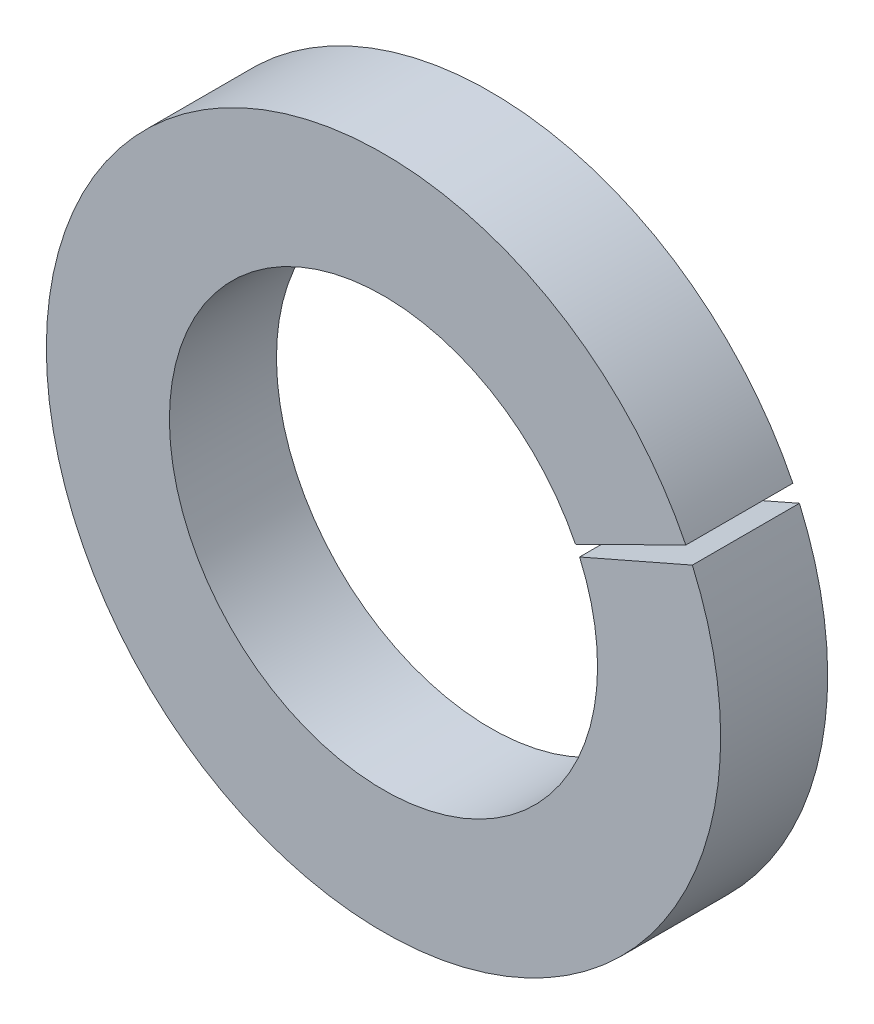
ISO-10303-21;
HEADER;
FILE_DESCRIPTION(('STEP AP214'),'2;1');
FILE_NAME('part.step','',(''),(''),'','','');
FILE_SCHEMA(('AUTOMOTIVE_DESIGN { 1 0 10303 214 1 1 1 1 }'));
ENDSEC;
DATA;
#1=APPLICATION_CONTEXT('core data for automotive mechanical design processes');
#2=APPLICATION_PROTOCOL_DEFINITION('international standard','automotive_design',2000,#1);
#3=PRODUCT_CONTEXT('',#1,'mechanical');
#4=PRODUCT('Part','Part','',(#3));
#5=PRODUCT_RELATED_PRODUCT_CATEGORY('part','',(#4));
#6=PRODUCT_DEFINITION_FORMATION('','',#4);
#7=PRODUCT_DEFINITION_CONTEXT('part definition',#1,'design');
#8=PRODUCT_DEFINITION('design','',#6,#7);
#9=PRODUCT_DEFINITION_SHAPE('','',#8);
#10=(LENGTH_UNIT() NAMED_UNIT(*) SI_UNIT(.MILLI.,.METRE.));
#11=(NAMED_UNIT(*) PLANE_ANGLE_UNIT() SI_UNIT($,.RADIAN.));
#12=(NAMED_UNIT(*) SI_UNIT($,.STERADIAN.) SOLID_ANGLE_UNIT());
#13=UNCERTAINTY_MEASURE_WITH_UNIT(LENGTH_MEASURE(1.E-05),#10,'distance_accuracy_value','');
#14=(GEOMETRIC_REPRESENTATION_CONTEXT(3) GLOBAL_UNCERTAINTY_ASSIGNED_CONTEXT((#13)) GLOBAL_UNIT_ASSIGNED_CONTEXT((#10,
#11,#12)) REPRESENTATION_CONTEXT('',''));
#15=CARTESIAN_POINT('',(0.,0.,0.));
#16=DIRECTION('',(0.,0.,1.));
#17=DIRECTION('',(1.,0.,0.));
#18=AXIS2_PLACEMENT_3D('',#15,#16,#17);
#19=CARTESIAN_POINT('',(0.,0.,1.));
#20=DIRECTION('',(0.,0.,1.));
#21=DIRECTION('',(1.,0.,0.));
#22=AXIS2_PLACEMENT_3D('',#19,#20,#21);
#23=PLANE('',#22);
#24=DIRECTION('',(0.91612800253932,0.400885872741003,0.));
#25=VECTOR('',#24,1.);
#26=CARTESIAN_POINT('',(4.81245926481222,2.10587049741662,1.));
#27=LINE('',#26,#25);
#28=CARTESIAN_POINT('',(1.83225600507864,0.801771745482005,1.));
#29=VERTEX_POINT('',#28);
#30=CARTESIAN_POINT('',(2.88580320799886,1.26279049913416,1.));
#31=VERTEX_POINT('',#30);
#32=EDGE_CURVE('E77',#29,#31,#27,.T.);
#33=ORIENTED_EDGE('',*,*,#32,.F.);
#34=CARTESIAN_POINT('',(0.,0.,1.));
#35=DIRECTION('',(0.,0.,1.));
#36=DIRECTION('',(1.,0.,0.));
#37=AXIS2_PLACEMENT_3D('',#34,#35,#36);
#38=CIRCLE('',#37,2.);
#39=CARTESIAN_POINT('',(1.79340092634827,0.88527572957421,1.));
#40=VERTEX_POINT('',#39);
#41=EDGE_CURVE('E86',#40,#29,#38,.T.);
#42=ORIENTED_EDGE('',*,*,#41,.F.);
#43=DIRECTION('',(-0.896700463174137,-0.442637864787105,0.));
#44=VECTOR('',#43,1.);
#45=CARTESIAN_POINT('',(0.,0.,1.));
#46=LINE('',#45,#44);
#47=CARTESIAN_POINT('',(2.82460645899853,1.39430927407938,1.));
#48=VERTEX_POINT('',#47);
#49=EDGE_CURVE('E60',#48,#40,#46,.T.);
#50=ORIENTED_EDGE('',*,*,#49,.F.);
#51=CARTESIAN_POINT('',(0.,0.,1.));
#52=DIRECTION('',(0.,0.,1.));
#53=DIRECTION('',(1.,0.,0.));
#54=AXIS2_PLACEMENT_3D('',#51,#52,#53);
#55=CIRCLE('',#54,3.15);
#56=EDGE_CURVE('E88',#48,#31,#55,.T.);
#57=ORIENTED_EDGE('',*,*,#56,.T.);
#58=EDGE_LOOP('',(#33,#42,#50,#57));
#59=FACE_BOUND('',#58,.T.);
#60=ADVANCED_FACE('F38',(#59),#23,.T.);
#61=CARTESIAN_POINT('',(0.,0.,0.));
#62=DIRECTION('',(0.,0.,1.));
#63=DIRECTION('',(1.,0.,0.));
#64=AXIS2_PLACEMENT_3D('',#61,#62,#63);
#65=PLANE('',#64);
#66=CARTESIAN_POINT('',(0.,0.,0.));
#67=DIRECTION('',(0.,0.,1.));
#68=DIRECTION('',(1.,0.,0.));
#69=AXIS2_PLACEMENT_3D('',#66,#67,#68);
#70=CIRCLE('',#69,2.);
#71=CARTESIAN_POINT('',(1.79340092634828,0.88527572957421,0.));
#72=VERTEX_POINT('',#71);
#73=CARTESIAN_POINT('',(1.83225600507864,0.801771745482006,0.));
#74=VERTEX_POINT('',#73);
#75=EDGE_CURVE('E92',#72,#74,#70,.T.);
#76=ORIENTED_EDGE('',*,*,#75,.T.);
#77=DIRECTION('',(0.91612800253932,0.400885872741003,0.));
#78=VECTOR('',#77,1.);
#79=CARTESIAN_POINT('',(0.,0.,0.));
#80=LINE('',#79,#78);
#81=CARTESIAN_POINT('',(2.88580320799886,1.26279049913416,0.));
#82=VERTEX_POINT('',#81);
#83=EDGE_CURVE('E52',#74,#82,#80,.T.);
#84=ORIENTED_EDGE('',*,*,#83,.T.);
#85=CARTESIAN_POINT('',(0.,0.,0.));
#86=DIRECTION('',(0.,0.,1.));
#87=DIRECTION('',(1.,0.,0.));
#88=AXIS2_PLACEMENT_3D('',#85,#86,#87);
#89=CIRCLE('',#88,3.15);
#90=CARTESIAN_POINT('',(2.82460645899853,1.39430927407938,0.));
#91=VERTEX_POINT('',#90);
#92=EDGE_CURVE('E91',#91,#82,#89,.T.);
#93=ORIENTED_EDGE('',*,*,#92,.F.);
#94=DIRECTION('',(-0.896700463174138,-0.442637864787105,0.));
#95=VECTOR('',#94,1.);
#96=CARTESIAN_POINT('',(0.,0.,0.));
#97=LINE('',#96,#95);
#98=EDGE_CURVE('E103',#91,#72,#97,.T.);
#99=ORIENTED_EDGE('',*,*,#98,.T.);
#100=EDGE_LOOP('',(#76,#84,#93,#99));
#101=FACE_BOUND('',#100,.T.);
#102=ADVANCED_FACE('F107',(#101),#65,.F.);
#103=CARTESIAN_POINT('',(0.,0.,1.));
#104=DIRECTION('',(0.,0.,-1.));
#105=DIRECTION('',(-1.,0.,0.));
#106=AXIS2_PLACEMENT_3D('',#103,#104,#105);
#107=CYLINDRICAL_SURFACE('',#106,3.15);
#108=ORIENTED_EDGE('',*,*,#92,.T.);
#109=DIRECTION('',(0.,0.,-1.));
#110=VECTOR('',#109,1.);
#111=CARTESIAN_POINT('',(2.88580320799886,1.26279049913416,1.));
#112=LINE('',#111,#110);
#113=EDGE_CURVE('E96',#82,#31,#112,.F.);
#114=ORIENTED_EDGE('',*,*,#113,.T.);
#115=ORIENTED_EDGE('',*,*,#56,.F.);
#116=DIRECTION('',(0.,0.,-1.));
#117=VECTOR('',#116,1.);
#118=CARTESIAN_POINT('',(2.82460645899853,1.39430927407938,1.));
#119=LINE('',#118,#117);
#120=EDGE_CURVE('E108',#48,#91,#119,.T.);
#121=ORIENTED_EDGE('',*,*,#120,.T.);
#122=EDGE_LOOP('',(#108,#114,#115,#121));
#123=FACE_BOUND('',#122,.T.);
#124=ADVANCED_FACE('F40',(#123),#107,.T.);
#125=CARTESIAN_POINT('',(0.,0.,1.));
#126=DIRECTION('',(0.,0.,-1.));
#127=DIRECTION('',(-1.,0.,0.));
#128=AXIS2_PLACEMENT_3D('',#125,#126,#127);
#129=CYLINDRICAL_SURFACE('',#128,2.);
#130=DIRECTION('',(0.,0.,-1.));
#131=VECTOR('',#130,1.);
#132=CARTESIAN_POINT('',(1.83225600507864,0.801771745482006,1.));
#133=LINE('',#132,#131);
#134=EDGE_CURVE('E11',#74,#29,#133,.F.);
#135=ORIENTED_EDGE('',*,*,#134,.F.);
#136=ORIENTED_EDGE('',*,*,#75,.F.);
#137=DIRECTION('',(0.,0.,-1.));
#138=VECTOR('',#137,1.);
#139=CARTESIAN_POINT('',(1.79340092634828,0.88527572957421,1.));
#140=LINE('',#139,#138);
#141=EDGE_CURVE('E46',#40,#72,#140,.T.);
#142=ORIENTED_EDGE('',*,*,#141,.F.);
#143=ORIENTED_EDGE('',*,*,#41,.T.);
#144=EDGE_LOOP('',(#135,#136,#142,#143));
#145=FACE_BOUND('',#144,.T.);
#146=ADVANCED_FACE('F90',(#145),#129,.F.);
#147=CARTESIAN_POINT('',(0.,0.,-9.));
#148=DIRECTION('',(-0.442637864787105,0.896700463174138,0.));
#149=DIRECTION('',(-0.896700463174138,-0.442637864787105,0.));
#150=AXIS2_PLACEMENT_3D('',#147,#148,#149);
#151=PLANE('',#150);
#152=ORIENTED_EDGE('',*,*,#49,.T.);
#153=ORIENTED_EDGE('',*,*,#141,.T.);
#154=ORIENTED_EDGE('',*,*,#98,.F.);
#155=ORIENTED_EDGE('',*,*,#120,.F.);
#156=EDGE_LOOP('',(#152,#153,#154,#155));
#157=FACE_BOUND('',#156,.T.);
#158=ADVANCED_FACE('F102',(#157),#151,.F.);
#159=CARTESIAN_POINT('',(4.81245926481222,2.10587049741662,-9.));
#160=DIRECTION('',(0.400885872741003,-0.91612800253932,0.));
#161=DIRECTION('',(0.91612800253932,0.400885872741003,0.));
#162=AXIS2_PLACEMENT_3D('',#159,#160,#161);
#163=PLANE('',#162);
#164=ORIENTED_EDGE('',*,*,#83,.F.);
#165=ORIENTED_EDGE('',*,*,#134,.T.);
#166=ORIENTED_EDGE('',*,*,#32,.T.);
#167=ORIENTED_EDGE('',*,*,#113,.F.);
#168=EDGE_LOOP('',(#164,#165,#166,#167));
#169=FACE_BOUND('',#168,.T.);
#170=ADVANCED_FACE('F76',(#169),#163,.F.);
#171=CLOSED_SHELL('',(#60,#102,#124,#146,#158,#170));
#172=MANIFOLD_SOLID_BREP('B2',#171);
#173=ADVANCED_BREP_SHAPE_REPRESENTATION('',(#18,#172),#14);
#174=SHAPE_DEFINITION_REPRESENTATION(#9,#173);
ENDSEC;
END-ISO-10303-21;
